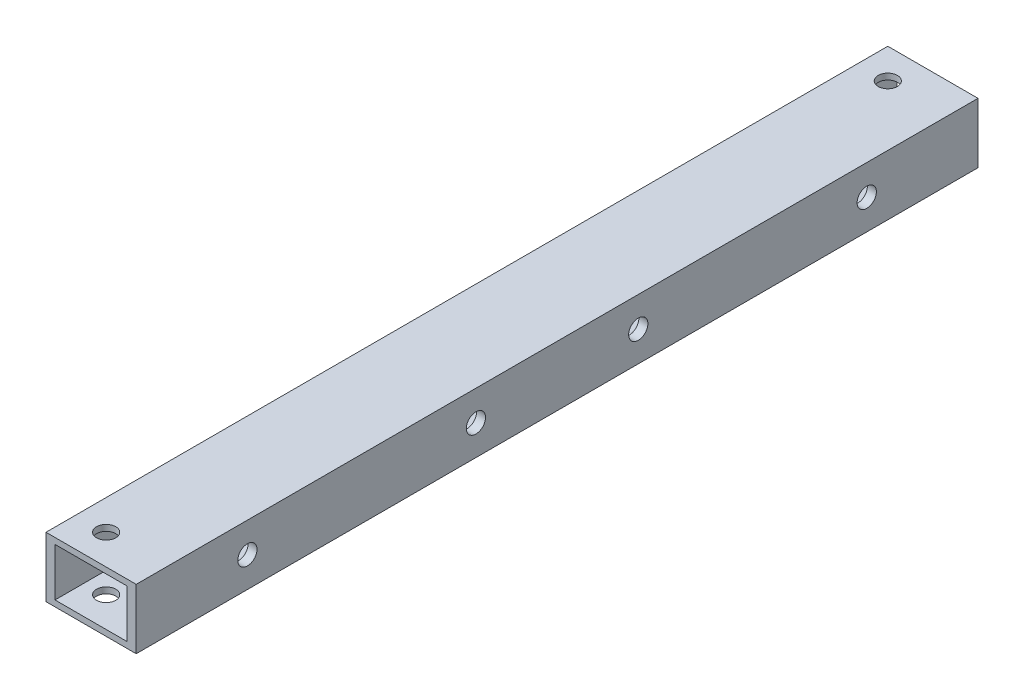
ISO-10303-21;
HEADER;
FILE_DESCRIPTION(('STEP AP214'),'2;1');
FILE_NAME('part.step','',(''),(''),'','','');
FILE_SCHEMA(('AUTOMOTIVE_DESIGN { 1 0 10303 214 1 1 1 1 }'));
ENDSEC;
DATA;
#1=APPLICATION_CONTEXT('core data for automotive mechanical design processes');
#2=APPLICATION_PROTOCOL_DEFINITION('international standard','automotive_design',2000,#1);
#3=PRODUCT_CONTEXT('',#1,'mechanical');
#4=PRODUCT('Part','Part','',(#3));
#5=PRODUCT_RELATED_PRODUCT_CATEGORY('part','',(#4));
#6=PRODUCT_DEFINITION_FORMATION('','',#4);
#7=PRODUCT_DEFINITION_CONTEXT('part definition',#1,'design');
#8=PRODUCT_DEFINITION('design','',#6,#7);
#9=PRODUCT_DEFINITION_SHAPE('','',#8);
#10=(LENGTH_UNIT() NAMED_UNIT(*) SI_UNIT(.MILLI.,.METRE.));
#11=(NAMED_UNIT(*) PLANE_ANGLE_UNIT() SI_UNIT($,.RADIAN.));
#12=(NAMED_UNIT(*) SI_UNIT($,.STERADIAN.) SOLID_ANGLE_UNIT());
#13=UNCERTAINTY_MEASURE_WITH_UNIT(LENGTH_MEASURE(1.E-05),#10,'distance_accuracy_value','');
#14=(GEOMETRIC_REPRESENTATION_CONTEXT(3) GLOBAL_UNCERTAINTY_ASSIGNED_CONTEXT((#13)) GLOBAL_UNIT_ASSIGNED_CONTEXT((#10,
#11,#12)) REPRESENTATION_CONTEXT('',''));
#15=CARTESIAN_POINT('',(0.,0.,0.));
#16=DIRECTION('',(0.,0.,1.));
#17=DIRECTION('',(1.,0.,0.));
#18=AXIS2_PLACEMENT_3D('',#15,#16,#17);
#19=CARTESIAN_POINT('',(0.,0.,70.));
#20=DIRECTION('',(0.,0.,-1.));
#21=DIRECTION('',(-1.,0.,0.));
#22=AXIS2_PLACEMENT_3D('',#19,#20,#21);
#23=PLANE('',#22);
#24=DIRECTION('',(0.,1.,0.));
#25=VECTOR('',#24,1.);
#26=CARTESIAN_POINT('',(7.5,-5.,70.));
#27=LINE('',#26,#25);
#28=CARTESIAN_POINT('',(7.5,-5.,70.));
#29=VERTEX_POINT('',#28);
#30=CARTESIAN_POINT('',(7.5,5.,70.));
#31=VERTEX_POINT('',#30);
#32=EDGE_CURVE('E181',#29,#31,#27,.T.);
#33=ORIENTED_EDGE('',*,*,#32,.T.);
#34=DIRECTION('',(-1.,0.,0.));
#35=VECTOR('',#34,1.);
#36=CARTESIAN_POINT('',(-7.5,5.,70.));
#37=LINE('',#36,#35);
#38=CARTESIAN_POINT('',(-7.5,5.,70.));
#39=VERTEX_POINT('',#38);
#40=EDGE_CURVE('E183',#31,#39,#37,.T.);
#41=ORIENTED_EDGE('',*,*,#40,.T.);
#42=DIRECTION('',(0.,-1.,0.));
#43=VECTOR('',#42,1.);
#44=CARTESIAN_POINT('',(-7.5,-5.,70.));
#45=LINE('',#44,#43);
#46=CARTESIAN_POINT('',(-7.5,-5.,70.));
#47=VERTEX_POINT('',#46);
#48=EDGE_CURVE('E185',#39,#47,#45,.T.);
#49=ORIENTED_EDGE('',*,*,#48,.T.);
#50=DIRECTION('',(1.,0.,0.));
#51=VECTOR('',#50,1.);
#52=CARTESIAN_POINT('',(-7.5,-5.,70.));
#53=LINE('',#52,#51);
#54=EDGE_CURVE('E57',#47,#29,#53,.T.);
#55=ORIENTED_EDGE('',*,*,#54,.T.);
#56=EDGE_LOOP('',(#33,#41,#49,#55));
#57=FACE_BOUND('',#56,.T.);
#58=DIRECTION('',(0.,1.,0.));
#59=VECTOR('',#58,1.);
#60=CARTESIAN_POINT('',(6.,-4.,70.));
#61=LINE('',#60,#59);
#62=CARTESIAN_POINT('',(6.,-4.,70.));
#63=VERTEX_POINT('',#62);
#64=CARTESIAN_POINT('',(6.,4.,70.));
#65=VERTEX_POINT('',#64);
#66=EDGE_CURVE('E170',#63,#65,#61,.T.);
#67=ORIENTED_EDGE('',*,*,#66,.F.);
#68=DIRECTION('',(1.,0.,0.));
#69=VECTOR('',#68,1.);
#70=CARTESIAN_POINT('',(-6.,-4.,70.));
#71=LINE('',#70,#69);
#72=CARTESIAN_POINT('',(-6.,-4.,70.));
#73=VERTEX_POINT('',#72);
#74=EDGE_CURVE('E104',#73,#63,#71,.T.);
#75=ORIENTED_EDGE('',*,*,#74,.F.);
#76=DIRECTION('',(0.,-1.,0.));
#77=VECTOR('',#76,1.);
#78=CARTESIAN_POINT('',(-6.,-4.,70.));
#79=LINE('',#78,#77);
#80=CARTESIAN_POINT('',(-6.,4.,70.));
#81=VERTEX_POINT('',#80);
#82=EDGE_CURVE('E174',#81,#73,#79,.T.);
#83=ORIENTED_EDGE('',*,*,#82,.F.);
#84=DIRECTION('',(-1.,0.,0.));
#85=VECTOR('',#84,1.);
#86=CARTESIAN_POINT('',(-6.,4.,70.));
#87=LINE('',#86,#85);
#88=EDGE_CURVE('E172',#65,#81,#87,.T.);
#89=ORIENTED_EDGE('',*,*,#88,.F.);
#90=EDGE_LOOP('',(#67,#75,#83,#89));
#91=FACE_BOUND('',#90,.T.);
#92=ADVANCED_FACE('F32',(#57,#91),#23,.F.);
#93=CARTESIAN_POINT('',(7.5,-5.,70.));
#94=DIRECTION('',(-1.,0.,0.));
#95=DIRECTION('',(0.,0.,1.));
#96=AXIS2_PLACEMENT_3D('',#93,#94,#95);
#97=PLANE('',#96);
#98=CARTESIAN_POINT('',(7.5,0.,-51.5));
#99=DIRECTION('',(1.,0.,0.));
#100=DIRECTION('',(0.,0.,-1.));
#101=AXIS2_PLACEMENT_3D('',#98,#99,#100);
#102=CIRCLE('',#101,1.6);
#103=CARTESIAN_POINT('',(7.5,0.,-53.1));
#104=VERTEX_POINT('',#103);
#105=EDGE_CURVE('E474',#104,#104,#102,.T.);
#106=ORIENTED_EDGE('',*,*,#105,.F.);
#107=EDGE_LOOP('',(#106));
#108=FACE_BOUND('',#107,.T.);
#109=CARTESIAN_POINT('',(7.5,0.,-13.5));
#110=DIRECTION('',(-1.,0.,0.));
#111=DIRECTION('',(0.,0.,1.));
#112=AXIS2_PLACEMENT_3D('',#109,#110,#111);
#113=CIRCLE('',#112,1.6);
#114=CARTESIAN_POINT('',(7.5,0.,-11.9));
#115=VERTEX_POINT('',#114);
#116=EDGE_CURVE('E209',#115,#115,#113,.T.);
#117=ORIENTED_EDGE('',*,*,#116,.T.);
#118=EDGE_LOOP('',(#117));
#119=FACE_BOUND('',#118,.T.);
#120=CARTESIAN_POINT('',(7.5,0.,51.5));
#121=DIRECTION('',(-1.,0.,0.));
#122=DIRECTION('',(0.,0.,1.));
#123=AXIS2_PLACEMENT_3D('',#120,#121,#122);
#124=CIRCLE('',#123,1.6);
#125=CARTESIAN_POINT('',(7.5,0.,53.1));
#126=VERTEX_POINT('',#125);
#127=EDGE_CURVE('E141',#126,#126,#124,.T.);
#128=ORIENTED_EDGE('',*,*,#127,.T.);
#129=EDGE_LOOP('',(#128));
#130=FACE_BOUND('',#129,.T.);
#131=CARTESIAN_POINT('',(7.5,0.,13.5));
#132=DIRECTION('',(1.,0.,0.));
#133=DIRECTION('',(0.,0.,-1.));
#134=AXIS2_PLACEMENT_3D('',#131,#132,#133);
#135=CIRCLE('',#134,1.6);
#136=CARTESIAN_POINT('',(7.5,0.,11.9));
#137=VERTEX_POINT('',#136);
#138=EDGE_CURVE('E160',#137,#137,#135,.T.);
#139=ORIENTED_EDGE('',*,*,#138,.F.);
#140=EDGE_LOOP('',(#139));
#141=FACE_BOUND('',#140,.T.);
#142=DIRECTION('',(0.,0.,-1.));
#143=VECTOR('',#142,1.);
#144=CARTESIAN_POINT('',(7.5,-5.,70.));
#145=LINE('',#144,#143);
#146=CARTESIAN_POINT('',(7.5,-5.,-70.));
#147=VERTEX_POINT('',#146);
#148=EDGE_CURVE('E188',#29,#147,#145,.T.);
#149=ORIENTED_EDGE('',*,*,#148,.T.);
#150=DIRECTION('',(0.,1.,0.));
#151=VECTOR('',#150,1.);
#152=CARTESIAN_POINT('',(7.5,-5.,-70.));
#153=LINE('',#152,#151);
#154=CARTESIAN_POINT('',(7.5,5.,-70.));
#155=VERTEX_POINT('',#154);
#156=EDGE_CURVE('E128',#147,#155,#153,.T.);
#157=ORIENTED_EDGE('',*,*,#156,.T.);
#158=DIRECTION('',(0.,0.,-1.));
#159=VECTOR('',#158,1.);
#160=CARTESIAN_POINT('',(7.5,5.,70.));
#161=LINE('',#160,#159);
#162=EDGE_CURVE('E11',#31,#155,#161,.T.);
#163=ORIENTED_EDGE('',*,*,#162,.F.);
#164=ORIENTED_EDGE('',*,*,#32,.F.);
#165=EDGE_LOOP('',(#149,#157,#163,#164));
#166=FACE_BOUND('',#165,.T.);
#167=ADVANCED_FACE('F34',(#108,#119,#130,#141,#166),#97,.F.);
#168=CARTESIAN_POINT('',(-7.5,5.,70.));
#169=DIRECTION('',(0.,-1.,0.));
#170=DIRECTION('',(0.,0.,-1.));
#171=AXIS2_PLACEMENT_3D('',#168,#169,#170);
#172=PLANE('',#171);
#173=CARTESIAN_POINT('',(-2.5,5.,-65.));
#174=DIRECTION('',(0.,-1.,0.));
#175=DIRECTION('',(0.,0.,-1.));
#176=AXIS2_PLACEMENT_3D('',#173,#174,#175);
#177=CIRCLE('',#176,1.6);
#178=CARTESIAN_POINT('',(-2.5,5.,-66.6));
#179=VERTEX_POINT('',#178);
#180=EDGE_CURVE('E212',#179,#179,#177,.T.);
#181=ORIENTED_EDGE('',*,*,#180,.T.);
#182=EDGE_LOOP('',(#181));
#183=FACE_BOUND('',#182,.T.);
#184=CARTESIAN_POINT('',(-2.5,5.,65.));
#185=DIRECTION('',(0.,1.,0.));
#186=DIRECTION('',(0.,0.,1.));
#187=AXIS2_PLACEMENT_3D('',#184,#185,#186);
#188=CIRCLE('',#187,1.6);
#189=CARTESIAN_POINT('',(-2.5,5.,66.6));
#190=VERTEX_POINT('',#189);
#191=EDGE_CURVE('E150',#190,#190,#188,.T.);
#192=ORIENTED_EDGE('',*,*,#191,.F.);
#193=EDGE_LOOP('',(#192));
#194=FACE_BOUND('',#193,.T.);
#195=ORIENTED_EDGE('',*,*,#162,.T.);
#196=DIRECTION('',(-1.,0.,0.));
#197=VECTOR('',#196,1.);
#198=CARTESIAN_POINT('',(-7.5,5.,-70.));
#199=LINE('',#198,#197);
#200=CARTESIAN_POINT('',(-7.5,5.,-70.));
#201=VERTEX_POINT('',#200);
#202=EDGE_CURVE('E137',#155,#201,#199,.T.);
#203=ORIENTED_EDGE('',*,*,#202,.T.);
#204=DIRECTION('',(0.,0.,-1.));
#205=VECTOR('',#204,1.);
#206=CARTESIAN_POINT('',(-7.5,5.,70.));
#207=LINE('',#206,#205);
#208=EDGE_CURVE('E41',#39,#201,#207,.T.);
#209=ORIENTED_EDGE('',*,*,#208,.F.);
#210=ORIENTED_EDGE('',*,*,#40,.F.);
#211=EDGE_LOOP('',(#195,#203,#209,#210));
#212=FACE_BOUND('',#211,.T.);
#213=ADVANCED_FACE('F240',(#183,#194,#212),#172,.F.);
#214=CARTESIAN_POINT('',(-7.5,-5.,70.));
#215=DIRECTION('',(1.,0.,0.));
#216=DIRECTION('',(0.,0.,-1.));
#217=AXIS2_PLACEMENT_3D('',#214,#215,#216);
#218=PLANE('',#217);
#219=CARTESIAN_POINT('',(-7.5,0.,-51.5));
#220=DIRECTION('',(1.,0.,0.));
#221=DIRECTION('',(0.,0.,-1.));
#222=AXIS2_PLACEMENT_3D('',#219,#220,#221);
#223=CIRCLE('',#222,1.6);
#224=CARTESIAN_POINT('',(-7.5,0.,-53.1));
#225=VERTEX_POINT('',#224);
#226=EDGE_CURVE('E475',#225,#225,#223,.T.);
#227=ORIENTED_EDGE('',*,*,#226,.T.);
#228=EDGE_LOOP('',(#227));
#229=FACE_BOUND('',#228,.T.);
#230=CARTESIAN_POINT('',(-7.5,0.,-13.5));
#231=DIRECTION('',(-1.,0.,0.));
#232=DIRECTION('',(0.,0.,1.));
#233=AXIS2_PLACEMENT_3D('',#230,#231,#232);
#234=CIRCLE('',#233,1.6);
#235=CARTESIAN_POINT('',(-7.5,0.,-11.9));
#236=VERTEX_POINT('',#235);
#237=EDGE_CURVE('E201',#236,#236,#234,.T.);
#238=ORIENTED_EDGE('',*,*,#237,.F.);
#239=EDGE_LOOP('',(#238));
#240=FACE_BOUND('',#239,.T.);
#241=CARTESIAN_POINT('',(-7.5,0.,51.5));
#242=DIRECTION('',(-1.,0.,0.));
#243=DIRECTION('',(0.,0.,1.));
#244=AXIS2_PLACEMENT_3D('',#241,#242,#243);
#245=CIRCLE('',#244,1.6);
#246=CARTESIAN_POINT('',(-7.5,0.,53.1));
#247=VERTEX_POINT('',#246);
#248=EDGE_CURVE('E140',#247,#247,#245,.T.);
#249=ORIENTED_EDGE('',*,*,#248,.F.);
#250=EDGE_LOOP('',(#249));
#251=FACE_BOUND('',#250,.T.);
#252=CARTESIAN_POINT('',(-7.5,0.,13.5));
#253=DIRECTION('',(1.,0.,0.));
#254=DIRECTION('',(0.,0.,-1.));
#255=AXIS2_PLACEMENT_3D('',#252,#253,#254);
#256=CIRCLE('',#255,1.6);
#257=CARTESIAN_POINT('',(-7.5,0.,11.9));
#258=VERTEX_POINT('',#257);
#259=EDGE_CURVE('E161',#258,#258,#256,.T.);
#260=ORIENTED_EDGE('',*,*,#259,.T.);
#261=EDGE_LOOP('',(#260));
#262=FACE_BOUND('',#261,.T.);
#263=ORIENTED_EDGE('',*,*,#208,.T.);
#264=DIRECTION('',(0.,-1.,0.));
#265=VECTOR('',#264,1.);
#266=CARTESIAN_POINT('',(-7.5,-5.,-70.));
#267=LINE('',#266,#265);
#268=CARTESIAN_POINT('',(-7.5,-5.,-70.));
#269=VERTEX_POINT('',#268);
#270=EDGE_CURVE('E134',#201,#269,#267,.T.);
#271=ORIENTED_EDGE('',*,*,#270,.T.);
#272=DIRECTION('',(0.,0.,-1.));
#273=VECTOR('',#272,1.);
#274=CARTESIAN_POINT('',(-7.5,-5.,70.));
#275=LINE('',#274,#273);
#276=EDGE_CURVE('E190',#47,#269,#275,.T.);
#277=ORIENTED_EDGE('',*,*,#276,.F.);
#278=ORIENTED_EDGE('',*,*,#48,.F.);
#279=EDGE_LOOP('',(#263,#271,#277,#278));
#280=FACE_BOUND('',#279,.T.);
#281=ADVANCED_FACE('F257',(#229,#240,#251,#262,#280),#218,.F.);
#282=CARTESIAN_POINT('',(-7.5,-5.,70.));
#283=DIRECTION('',(0.,1.,0.));
#284=DIRECTION('',(0.,0.,1.));
#285=AXIS2_PLACEMENT_3D('',#282,#283,#284);
#286=PLANE('',#285);
#287=CARTESIAN_POINT('',(-2.5,-5.,-65.));
#288=DIRECTION('',(0.,-1.,0.));
#289=DIRECTION('',(0.,0.,-1.));
#290=AXIS2_PLACEMENT_3D('',#287,#288,#289);
#291=CIRCLE('',#290,1.6);
#292=CARTESIAN_POINT('',(-2.5,-5.,-66.6));
#293=VERTEX_POINT('',#292);
#294=EDGE_CURVE('E205',#293,#293,#291,.T.);
#295=ORIENTED_EDGE('',*,*,#294,.F.);
#296=EDGE_LOOP('',(#295));
#297=FACE_BOUND('',#296,.T.);
#298=CARTESIAN_POINT('',(-2.5,-5.,65.));
#299=DIRECTION('',(0.,1.,0.));
#300=DIRECTION('',(0.,0.,1.));
#301=AXIS2_PLACEMENT_3D('',#298,#299,#300);
#302=CIRCLE('',#301,1.6);
#303=CARTESIAN_POINT('',(-2.5,-5.,66.6));
#304=VERTEX_POINT('',#303);
#305=EDGE_CURVE('E151',#304,#304,#302,.T.);
#306=ORIENTED_EDGE('',*,*,#305,.T.);
#307=EDGE_LOOP('',(#306));
#308=FACE_BOUND('',#307,.T.);
#309=ORIENTED_EDGE('',*,*,#276,.T.);
#310=DIRECTION('',(1.,0.,0.));
#311=VECTOR('',#310,1.);
#312=CARTESIAN_POINT('',(-7.5,-5.,-70.));
#313=LINE('',#312,#311);
#314=EDGE_CURVE('E131',#269,#147,#313,.T.);
#315=ORIENTED_EDGE('',*,*,#314,.T.);
#316=ORIENTED_EDGE('',*,*,#148,.F.);
#317=ORIENTED_EDGE('',*,*,#54,.F.);
#318=EDGE_LOOP('',(#309,#315,#316,#317));
#319=FACE_BOUND('',#318,.T.);
#320=ADVANCED_FACE('F253',(#297,#308,#319),#286,.F.);
#321=CARTESIAN_POINT('',(6.,-4.,70.));
#322=DIRECTION('',(-1.,0.,0.));
#323=DIRECTION('',(0.,0.,1.));
#324=AXIS2_PLACEMENT_3D('',#321,#322,#323);
#325=PLANE('',#324);
#326=CARTESIAN_POINT('',(6.,0.,-51.5));
#327=DIRECTION('',(-1.,0.,0.));
#328=DIRECTION('',(0.,0.,1.));
#329=AXIS2_PLACEMENT_3D('',#326,#327,#328);
#330=CIRCLE('',#329,1.6);
#331=CARTESIAN_POINT('',(6.,0.,-49.9));
#332=VERTEX_POINT('',#331);
#333=EDGE_CURVE('E217',#332,#332,#330,.F.);
#334=ORIENTED_EDGE('',*,*,#333,.T.);
#335=EDGE_LOOP('',(#334));
#336=FACE_BOUND('',#335,.T.);
#337=CARTESIAN_POINT('',(6.,0.,-13.5));
#338=DIRECTION('',(-1.,0.,0.));
#339=DIRECTION('',(0.,0.,1.));
#340=AXIS2_PLACEMENT_3D('',#337,#338,#339);
#341=CIRCLE('',#340,1.6);
#342=CARTESIAN_POINT('',(6.,0.,-11.9));
#343=VERTEX_POINT('',#342);
#344=EDGE_CURVE('E116',#343,#343,#341,.F.);
#345=ORIENTED_EDGE('',*,*,#344,.T.);
#346=EDGE_LOOP('',(#345));
#347=FACE_BOUND('',#346,.T.);
#348=CARTESIAN_POINT('',(6.,0.,51.5));
#349=DIRECTION('',(-1.,0.,0.));
#350=DIRECTION('',(0.,0.,1.));
#351=AXIS2_PLACEMENT_3D('',#348,#349,#350);
#352=CIRCLE('',#351,1.6);
#353=CARTESIAN_POINT('',(6.,0.,53.1));
#354=VERTEX_POINT('',#353);
#355=EDGE_CURVE('E147',#354,#354,#352,.T.);
#356=ORIENTED_EDGE('',*,*,#355,.F.);
#357=EDGE_LOOP('',(#356));
#358=FACE_BOUND('',#357,.T.);
#359=CARTESIAN_POINT('',(6.,0.,13.5));
#360=DIRECTION('',(-1.,0.,0.));
#361=DIRECTION('',(0.,0.,1.));
#362=AXIS2_PLACEMENT_3D('',#359,#360,#361);
#363=CIRCLE('',#362,1.6);
#364=CARTESIAN_POINT('',(6.,0.,15.1));
#365=VERTEX_POINT('',#364);
#366=EDGE_CURVE('E167',#365,#365,#363,.T.);
#367=ORIENTED_EDGE('',*,*,#366,.F.);
#368=EDGE_LOOP('',(#367));
#369=FACE_BOUND('',#368,.T.);
#370=DIRECTION('',(0.,0.,-1.));
#371=VECTOR('',#370,1.);
#372=CARTESIAN_POINT('',(6.,4.,70.));
#373=LINE('',#372,#371);
#374=CARTESIAN_POINT('',(6.,4.,-70.));
#375=VERTEX_POINT('',#374);
#376=EDGE_CURVE('E112',#65,#375,#373,.T.);
#377=ORIENTED_EDGE('',*,*,#376,.T.);
#378=DIRECTION('',(0.,1.,0.));
#379=VECTOR('',#378,1.);
#380=CARTESIAN_POINT('',(6.,-4.,-70.));
#381=LINE('',#380,#379);
#382=CARTESIAN_POINT('',(6.,-4.,-70.));
#383=VERTEX_POINT('',#382);
#384=EDGE_CURVE('E109',#383,#375,#381,.T.);
#385=ORIENTED_EDGE('',*,*,#384,.F.);
#386=DIRECTION('',(0.,0.,-1.));
#387=VECTOR('',#386,1.);
#388=CARTESIAN_POINT('',(6.,-4.,70.));
#389=LINE('',#388,#387);
#390=EDGE_CURVE('E97',#63,#383,#389,.T.);
#391=ORIENTED_EDGE('',*,*,#390,.F.);
#392=ORIENTED_EDGE('',*,*,#66,.T.);
#393=EDGE_LOOP('',(#377,#385,#391,#392));
#394=FACE_BOUND('',#393,.T.);
#395=ADVANCED_FACE('F110',(#336,#347,#358,#369,#394),#325,.T.);
#396=CARTESIAN_POINT('',(-6.,4.,70.));
#397=DIRECTION('',(0.,-1.,0.));
#398=DIRECTION('',(0.,0.,-1.));
#399=AXIS2_PLACEMENT_3D('',#396,#397,#398);
#400=PLANE('',#399);
#401=CARTESIAN_POINT('',(-2.5,4.,-65.));
#402=DIRECTION('',(0.,-1.,0.));
#403=DIRECTION('',(0.,0.,-1.));
#404=AXIS2_PLACEMENT_3D('',#401,#402,#403);
#405=CIRCLE('',#404,1.6);
#406=CARTESIAN_POINT('',(-2.5,4.,-66.6));
#407=VERTEX_POINT('',#406);
#408=EDGE_CURVE('E204',#407,#407,#405,.F.);
#409=ORIENTED_EDGE('',*,*,#408,.T.);
#410=EDGE_LOOP('',(#409));
#411=FACE_BOUND('',#410,.T.);
#412=CARTESIAN_POINT('',(-2.5,4.,65.));
#413=DIRECTION('',(0.,-1.,0.));
#414=DIRECTION('',(0.,0.,-1.));
#415=AXIS2_PLACEMENT_3D('',#412,#413,#414);
#416=CIRCLE('',#415,1.6);
#417=CARTESIAN_POINT('',(-2.5,4.,63.4));
#418=VERTEX_POINT('',#417);
#419=EDGE_CURVE('E157',#418,#418,#416,.T.);
#420=ORIENTED_EDGE('',*,*,#419,.F.);
#421=EDGE_LOOP('',(#420));
#422=FACE_BOUND('',#421,.T.);
#423=DIRECTION('',(0.,0.,-1.));
#424=VECTOR('',#423,1.);
#425=CARTESIAN_POINT('',(-6.,4.,70.));
#426=LINE('',#425,#424);
#427=CARTESIAN_POINT('',(-6.,4.,-70.));
#428=VERTEX_POINT('',#427);
#429=EDGE_CURVE('E178',#81,#428,#426,.T.);
#430=ORIENTED_EDGE('',*,*,#429,.T.);
#431=DIRECTION('',(-1.,0.,0.));
#432=VECTOR('',#431,1.);
#433=CARTESIAN_POINT('',(-6.,4.,-70.));
#434=LINE('',#433,#432);
#435=EDGE_CURVE('E123',#375,#428,#434,.T.);
#436=ORIENTED_EDGE('',*,*,#435,.F.);
#437=ORIENTED_EDGE('',*,*,#376,.F.);
#438=ORIENTED_EDGE('',*,*,#88,.T.);
#439=EDGE_LOOP('',(#430,#436,#437,#438));
#440=FACE_BOUND('',#439,.T.);
#441=ADVANCED_FACE('F266',(#411,#422,#440),#400,.T.);
#442=CARTESIAN_POINT('',(-6.,-4.,70.));
#443=DIRECTION('',(1.,0.,0.));
#444=DIRECTION('',(0.,0.,-1.));
#445=AXIS2_PLACEMENT_3D('',#442,#443,#444);
#446=PLANE('',#445);
#447=CARTESIAN_POINT('',(-6.,0.,-51.5));
#448=DIRECTION('',(1.,0.,0.));
#449=DIRECTION('',(0.,0.,-1.));
#450=AXIS2_PLACEMENT_3D('',#447,#448,#449);
#451=CIRCLE('',#450,1.6);
#452=CARTESIAN_POINT('',(-6.,0.,-53.1));
#453=VERTEX_POINT('',#452);
#454=EDGE_CURVE('E36',#453,#453,#451,.F.);
#455=ORIENTED_EDGE('',*,*,#454,.T.);
#456=EDGE_LOOP('',(#455));
#457=FACE_BOUND('',#456,.T.);
#458=CARTESIAN_POINT('',(-6.,0.,-13.5));
#459=DIRECTION('',(1.,0.,0.));
#460=DIRECTION('',(0.,0.,-1.));
#461=AXIS2_PLACEMENT_3D('',#458,#459,#460);
#462=CIRCLE('',#461,1.6);
#463=CARTESIAN_POINT('',(-6.,0.,-15.1));
#464=VERTEX_POINT('',#463);
#465=EDGE_CURVE('E199',#464,#464,#462,.F.);
#466=ORIENTED_EDGE('',*,*,#465,.T.);
#467=EDGE_LOOP('',(#466));
#468=FACE_BOUND('',#467,.T.);
#469=CARTESIAN_POINT('',(-6.,0.,51.5));
#470=DIRECTION('',(1.,0.,0.));
#471=DIRECTION('',(0.,0.,-1.));
#472=AXIS2_PLACEMENT_3D('',#469,#470,#471);
#473=CIRCLE('',#472,1.6);
#474=CARTESIAN_POINT('',(-6.,0.,49.9));
#475=VERTEX_POINT('',#474);
#476=EDGE_CURVE('E144',#475,#475,#473,.T.);
#477=ORIENTED_EDGE('',*,*,#476,.F.);
#478=EDGE_LOOP('',(#477));
#479=FACE_BOUND('',#478,.T.);
#480=CARTESIAN_POINT('',(-6.,0.,13.5));
#481=DIRECTION('',(1.,0.,0.));
#482=DIRECTION('',(0.,0.,-1.));
#483=AXIS2_PLACEMENT_3D('',#480,#481,#482);
#484=CIRCLE('',#483,1.6);
#485=CARTESIAN_POINT('',(-6.,0.,11.9));
#486=VERTEX_POINT('',#485);
#487=EDGE_CURVE('E164',#486,#486,#484,.T.);
#488=ORIENTED_EDGE('',*,*,#487,.F.);
#489=EDGE_LOOP('',(#488));
#490=FACE_BOUND('',#489,.T.);
#491=DIRECTION('',(0.,0.,-1.));
#492=VECTOR('',#491,1.);
#493=CARTESIAN_POINT('',(-6.,-4.,70.));
#494=LINE('',#493,#492);
#495=CARTESIAN_POINT('',(-6.,-4.,-70.));
#496=VERTEX_POINT('',#495);
#497=EDGE_CURVE('E49',#73,#496,#494,.T.);
#498=ORIENTED_EDGE('',*,*,#497,.T.);
#499=DIRECTION('',(0.,-1.,0.));
#500=VECTOR('',#499,1.);
#501=CARTESIAN_POINT('',(-6.,-4.,-70.));
#502=LINE('',#501,#500);
#503=EDGE_CURVE('E121',#428,#496,#502,.T.);
#504=ORIENTED_EDGE('',*,*,#503,.F.);
#505=ORIENTED_EDGE('',*,*,#429,.F.);
#506=ORIENTED_EDGE('',*,*,#82,.T.);
#507=EDGE_LOOP('',(#498,#504,#505,#506));
#508=FACE_BOUND('',#507,.T.);
#509=ADVANCED_FACE('F269',(#457,#468,#479,#490,#508),#446,.T.);
#510=CARTESIAN_POINT('',(-6.,-4.,70.));
#511=DIRECTION('',(0.,1.,0.));
#512=DIRECTION('',(0.,0.,1.));
#513=AXIS2_PLACEMENT_3D('',#510,#511,#512);
#514=PLANE('',#513);
#515=CARTESIAN_POINT('',(-2.5,-4.,-65.));
#516=DIRECTION('',(0.,1.,0.));
#517=DIRECTION('',(0.,0.,1.));
#518=AXIS2_PLACEMENT_3D('',#515,#516,#517);
#519=CIRCLE('',#518,1.6);
#520=CARTESIAN_POINT('',(-2.5,-4.,-63.4));
#521=VERTEX_POINT('',#520);
#522=EDGE_CURVE('E202',#521,#521,#519,.F.);
#523=ORIENTED_EDGE('',*,*,#522,.T.);
#524=EDGE_LOOP('',(#523));
#525=FACE_BOUND('',#524,.T.);
#526=CARTESIAN_POINT('',(-2.5,-4.,65.));
#527=DIRECTION('',(0.,1.,0.));
#528=DIRECTION('',(0.,0.,1.));
#529=AXIS2_PLACEMENT_3D('',#526,#527,#528);
#530=CIRCLE('',#529,1.6);
#531=CARTESIAN_POINT('',(-2.5,-4.,66.6));
#532=VERTEX_POINT('',#531);
#533=EDGE_CURVE('E154',#532,#532,#530,.T.);
#534=ORIENTED_EDGE('',*,*,#533,.F.);
#535=EDGE_LOOP('',(#534));
#536=FACE_BOUND('',#535,.T.);
#537=ORIENTED_EDGE('',*,*,#390,.T.);
#538=DIRECTION('',(1.,0.,0.));
#539=VECTOR('',#538,1.);
#540=CARTESIAN_POINT('',(-6.,-4.,-70.));
#541=LINE('',#540,#539);
#542=EDGE_CURVE('E101',#496,#383,#541,.T.);
#543=ORIENTED_EDGE('',*,*,#542,.F.);
#544=ORIENTED_EDGE('',*,*,#497,.F.);
#545=ORIENTED_EDGE('',*,*,#74,.T.);
#546=EDGE_LOOP('',(#537,#543,#544,#545));
#547=FACE_BOUND('',#546,.T.);
#548=ADVANCED_FACE('F99',(#525,#536,#547),#514,.T.);
#549=CARTESIAN_POINT('',(-7.5,0.,13.5));
#550=DIRECTION('',(1.,0.,0.));
#551=DIRECTION('',(0.,0.,-1.));
#552=AXIS2_PLACEMENT_3D('',#549,#550,#551);
#553=CYLINDRICAL_SURFACE('',#552,1.6);
#554=ORIENTED_EDGE('',*,*,#487,.T.);
#555=EDGE_LOOP('',(#554));
#556=FACE_BOUND('',#555,.T.);
#557=ORIENTED_EDGE('',*,*,#259,.F.);
#558=EDGE_LOOP('',(#557));
#559=FACE_BOUND('',#558,.T.);
#560=ADVANCED_FACE('F277',(#556,#559),#553,.F.);
#561=ORIENTED_EDGE('',*,*,#366,.T.);
#562=EDGE_LOOP('',(#561));
#563=FACE_BOUND('',#562,.T.);
#564=ORIENTED_EDGE('',*,*,#138,.T.);
#565=EDGE_LOOP('',(#564));
#566=FACE_BOUND('',#565,.T.);
#567=ADVANCED_FACE('F314',(#563,#566),#553,.F.);
#568=CARTESIAN_POINT('',(-2.5,-5.,65.));
#569=DIRECTION('',(0.,1.,0.));
#570=DIRECTION('',(0.,0.,1.));
#571=AXIS2_PLACEMENT_3D('',#568,#569,#570);
#572=CYLINDRICAL_SURFACE('',#571,1.6);
#573=ORIENTED_EDGE('',*,*,#533,.T.);
#574=EDGE_LOOP('',(#573));
#575=FACE_BOUND('',#574,.T.);
#576=ORIENTED_EDGE('',*,*,#305,.F.);
#577=EDGE_LOOP('',(#576));
#578=FACE_BOUND('',#577,.T.);
#579=ADVANCED_FACE('F304',(#575,#578),#572,.F.);
#580=ORIENTED_EDGE('',*,*,#419,.T.);
#581=EDGE_LOOP('',(#580));
#582=FACE_BOUND('',#581,.T.);
#583=ORIENTED_EDGE('',*,*,#191,.T.);
#584=EDGE_LOOP('',(#583));
#585=FACE_BOUND('',#584,.T.);
#586=ADVANCED_FACE('F301',(#582,#585),#572,.F.);
#587=CARTESIAN_POINT('',(7.5,0.,51.5));
#588=DIRECTION('',(-1.,0.,0.));
#589=DIRECTION('',(0.,0.,1.));
#590=AXIS2_PLACEMENT_3D('',#587,#588,#589);
#591=CYLINDRICAL_SURFACE('',#590,1.6);
#592=ORIENTED_EDGE('',*,*,#476,.T.);
#593=EDGE_LOOP('',(#592));
#594=FACE_BOUND('',#593,.T.);
#595=ORIENTED_EDGE('',*,*,#248,.T.);
#596=EDGE_LOOP('',(#595));
#597=FACE_BOUND('',#596,.T.);
#598=ADVANCED_FACE('F303',(#594,#597),#591,.F.);
#599=ORIENTED_EDGE('',*,*,#355,.T.);
#600=EDGE_LOOP('',(#599));
#601=FACE_BOUND('',#600,.T.);
#602=ORIENTED_EDGE('',*,*,#127,.F.);
#603=EDGE_LOOP('',(#602));
#604=FACE_BOUND('',#603,.T.);
#605=ADVANCED_FACE('F311',(#601,#604),#591,.F.);
#606=CARTESIAN_POINT('',(0.,0.,-70.));
#607=DIRECTION('',(0.,0.,1.));
#608=DIRECTION('',(-1.,0.,0.));
#609=AXIS2_PLACEMENT_3D('',#606,#607,#608);
#610=PLANE('',#609);
#611=ORIENTED_EDGE('',*,*,#542,.T.);
#612=ORIENTED_EDGE('',*,*,#384,.T.);
#613=ORIENTED_EDGE('',*,*,#435,.T.);
#614=ORIENTED_EDGE('',*,*,#503,.T.);
#615=EDGE_LOOP('',(#611,#612,#613,#614));
#616=FACE_BOUND('',#615,.T.);
#617=ORIENTED_EDGE('',*,*,#156,.F.);
#618=ORIENTED_EDGE('',*,*,#314,.F.);
#619=ORIENTED_EDGE('',*,*,#270,.F.);
#620=ORIENTED_EDGE('',*,*,#202,.F.);
#621=EDGE_LOOP('',(#617,#618,#619,#620));
#622=FACE_BOUND('',#621,.T.);
#623=ADVANCED_FACE('F118',(#616,#622),#610,.F.);
#624=CARTESIAN_POINT('',(-7.5,0.,-13.5));
#625=DIRECTION('',(1.,0.,0.));
#626=DIRECTION('',(0.,0.,-1.));
#627=AXIS2_PLACEMENT_3D('',#624,#625,#626);
#628=CYLINDRICAL_SURFACE('',#627,1.6);
#629=ORIENTED_EDGE('',*,*,#465,.F.);
#630=EDGE_LOOP('',(#629));
#631=FACE_BOUND('',#630,.T.);
#632=ORIENTED_EDGE('',*,*,#237,.T.);
#633=EDGE_LOOP('',(#632));
#634=FACE_BOUND('',#633,.T.);
#635=ADVANCED_FACE('F234',(#631,#634),#628,.F.);
#636=ORIENTED_EDGE('',*,*,#344,.F.);
#637=EDGE_LOOP('',(#636));
#638=FACE_BOUND('',#637,.T.);
#639=ORIENTED_EDGE('',*,*,#116,.F.);
#640=EDGE_LOOP('',(#639));
#641=FACE_BOUND('',#640,.T.);
#642=ADVANCED_FACE('F230',(#638,#641),#628,.F.);
#643=CARTESIAN_POINT('',(-2.5,-5.,-65.));
#644=DIRECTION('',(0.,1.,0.));
#645=DIRECTION('',(0.,0.,1.));
#646=AXIS2_PLACEMENT_3D('',#643,#644,#645);
#647=CYLINDRICAL_SURFACE('',#646,1.6);
#648=ORIENTED_EDGE('',*,*,#522,.F.);
#649=EDGE_LOOP('',(#648));
#650=FACE_BOUND('',#649,.T.);
#651=ORIENTED_EDGE('',*,*,#294,.T.);
#652=EDGE_LOOP('',(#651));
#653=FACE_BOUND('',#652,.T.);
#654=ADVANCED_FACE('F233',(#650,#653),#647,.F.);
#655=ORIENTED_EDGE('',*,*,#408,.F.);
#656=EDGE_LOOP('',(#655));
#657=FACE_BOUND('',#656,.T.);
#658=ORIENTED_EDGE('',*,*,#180,.F.);
#659=EDGE_LOOP('',(#658));
#660=FACE_BOUND('',#659,.T.);
#661=ADVANCED_FACE('F437',(#657,#660),#647,.F.);
#662=CARTESIAN_POINT('',(7.5,0.,-51.5));
#663=DIRECTION('',(-1.,0.,0.));
#664=DIRECTION('',(0.,0.,1.));
#665=AXIS2_PLACEMENT_3D('',#662,#663,#664);
#666=CYLINDRICAL_SURFACE('',#665,1.6);
#667=ORIENTED_EDGE('',*,*,#454,.F.);
#668=EDGE_LOOP('',(#667));
#669=FACE_BOUND('',#668,.T.);
#670=ORIENTED_EDGE('',*,*,#226,.F.);
#671=EDGE_LOOP('',(#670));
#672=FACE_BOUND('',#671,.T.);
#673=ADVANCED_FACE('F447',(#669,#672),#666,.F.);
#674=ORIENTED_EDGE('',*,*,#333,.F.);
#675=EDGE_LOOP('',(#674));
#676=FACE_BOUND('',#675,.T.);
#677=ORIENTED_EDGE('',*,*,#105,.T.);
#678=EDGE_LOOP('',(#677));
#679=FACE_BOUND('',#678,.T.);
#680=ADVANCED_FACE('F456',(#676,#679),#666,.F.);
#681=CLOSED_SHELL('',(#92,#167,#213,#281,#320,#395,#441,#509,#548,#560,#567,#579,#586,#598,#605,
#623,#635,#642,#654,#661,#673,#680));
#682=MANIFOLD_SOLID_BREP('B2',#681);
#683=ADVANCED_BREP_SHAPE_REPRESENTATION('',(#18,#682),#14);
#684=SHAPE_DEFINITION_REPRESENTATION(#9,#683);
ENDSEC;
END-ISO-10303-21;
